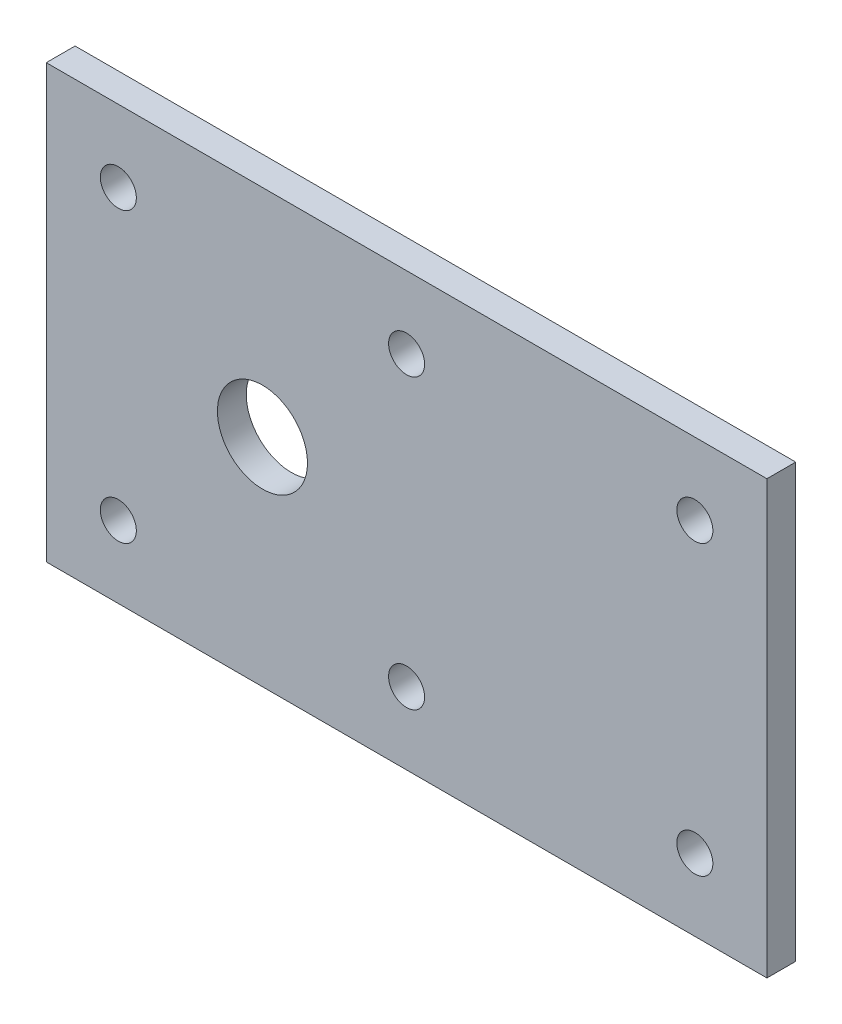
ISO-10303-21;
HEADER;
FILE_DESCRIPTION(('STEP AP214'),'2;1');
FILE_NAME('part.step','',(''),(''),'','','');
FILE_SCHEMA(('AUTOMOTIVE_DESIGN { 1 0 10303 214 1 1 1 1 }'));
ENDSEC;
DATA;
#1=APPLICATION_CONTEXT('core data for automotive mechanical design processes');
#2=APPLICATION_PROTOCOL_DEFINITION('international standard','automotive_design',2000,#1);
#3=PRODUCT_CONTEXT('',#1,'mechanical');
#4=PRODUCT('Part','Part','',(#3));
#5=PRODUCT_RELATED_PRODUCT_CATEGORY('part','',(#4));
#6=PRODUCT_DEFINITION_FORMATION('','',#4);
#7=PRODUCT_DEFINITION_CONTEXT('part definition',#1,'design');
#8=PRODUCT_DEFINITION('design','',#6,#7);
#9=PRODUCT_DEFINITION_SHAPE('','',#8);
#10=(LENGTH_UNIT() NAMED_UNIT(*) SI_UNIT(.MILLI.,.METRE.));
#11=(NAMED_UNIT(*) PLANE_ANGLE_UNIT() SI_UNIT($,.RADIAN.));
#12=(NAMED_UNIT(*) SI_UNIT($,.STERADIAN.) SOLID_ANGLE_UNIT());
#13=UNCERTAINTY_MEASURE_WITH_UNIT(LENGTH_MEASURE(1.E-05),#10,'distance_accuracy_value','');
#14=(GEOMETRIC_REPRESENTATION_CONTEXT(3) GLOBAL_UNCERTAINTY_ASSIGNED_CONTEXT((#13)) GLOBAL_UNIT_ASSIGNED_CONTEXT((#10,
#11,#12)) REPRESENTATION_CONTEXT('',''));
#15=CARTESIAN_POINT('',(0.,0.,0.));
#16=DIRECTION('',(0.,0.,1.));
#17=DIRECTION('',(1.,0.,0.));
#18=AXIS2_PLACEMENT_3D('',#15,#16,#17);
#19=CARTESIAN_POINT('',(-60.,60.,8.));
#20=DIRECTION('',(1.,0.,0.));
#21=DIRECTION('',(0.,1.,0.));
#22=AXIS2_PLACEMENT_3D('',#19,#20,#21);
#23=PLANE('',#22);
#24=DIRECTION('',(0.,-1.,0.));
#25=VECTOR('',#24,1.);
#26=CARTESIAN_POINT('',(-60.,60.,0.));
#27=LINE('',#26,#25);
#28=CARTESIAN_POINT('',(-60.,60.,0.));
#29=VERTEX_POINT('',#28);
#30=CARTESIAN_POINT('',(-60.,-60.,0.));
#31=VERTEX_POINT('',#30);
#32=EDGE_CURVE('E101',#29,#31,#27,.T.);
#33=ORIENTED_EDGE('',*,*,#32,.T.);
#34=DIRECTION('',(0.,0.,-1.));
#35=VECTOR('',#34,1.);
#36=CARTESIAN_POINT('',(-60.,-60.,8.));
#37=LINE('',#36,#35);
#38=CARTESIAN_POINT('',(-60.,-60.,8.));
#39=VERTEX_POINT('',#38);
#40=EDGE_CURVE('E92',#39,#31,#37,.T.);
#41=ORIENTED_EDGE('',*,*,#40,.F.);
#42=DIRECTION('',(0.,-1.,0.));
#43=VECTOR('',#42,1.);
#44=CARTESIAN_POINT('',(-60.,60.,8.));
#45=LINE('',#44,#43);
#46=CARTESIAN_POINT('',(-60.,60.,8.));
#47=VERTEX_POINT('',#46);
#48=EDGE_CURVE('E86',#47,#39,#45,.T.);
#49=ORIENTED_EDGE('',*,*,#48,.F.);
#50=DIRECTION('',(0.,0.,-1.));
#51=VECTOR('',#50,1.);
#52=CARTESIAN_POINT('',(-60.,60.,8.));
#53=LINE('',#52,#51);
#54=EDGE_CURVE('E97',#47,#29,#53,.T.);
#55=ORIENTED_EDGE('',*,*,#54,.T.);
#56=EDGE_LOOP('',(#33,#41,#49,#55));
#57=FACE_BOUND('',#56,.T.);
#58=ADVANCED_FACE('F32',(#57),#23,.F.);
#59=CARTESIAN_POINT('',(140.,-60.,8.));
#60=DIRECTION('',(0.,1.,0.));
#61=DIRECTION('',(0.,0.,1.));
#62=AXIS2_PLACEMENT_3D('',#59,#60,#61);
#63=PLANE('',#62);
#64=DIRECTION('',(1.,0.,0.));
#65=VECTOR('',#64,1.);
#66=CARTESIAN_POINT('',(140.,-60.,0.));
#67=LINE('',#66,#65);
#68=CARTESIAN_POINT('',(140.,-60.,0.));
#69=VERTEX_POINT('',#68);
#70=EDGE_CURVE('E91',#31,#69,#67,.T.);
#71=ORIENTED_EDGE('',*,*,#70,.T.);
#72=DIRECTION('',(0.,0.,-1.));
#73=VECTOR('',#72,1.);
#74=CARTESIAN_POINT('',(140.,-60.,8.));
#75=LINE('',#74,#73);
#76=CARTESIAN_POINT('',(140.,-60.,8.));
#77=VERTEX_POINT('',#76);
#78=EDGE_CURVE('E89',#77,#69,#75,.T.);
#79=ORIENTED_EDGE('',*,*,#78,.F.);
#80=DIRECTION('',(1.,0.,0.));
#81=VECTOR('',#80,1.);
#82=CARTESIAN_POINT('',(140.,-60.,8.));
#83=LINE('',#82,#81);
#84=EDGE_CURVE('E80',#39,#77,#83,.T.);
#85=ORIENTED_EDGE('',*,*,#84,.F.);
#86=ORIENTED_EDGE('',*,*,#40,.T.);
#87=EDGE_LOOP('',(#71,#79,#85,#86));
#88=FACE_BOUND('',#87,.T.);
#89=ADVANCED_FACE('F90',(#88),#63,.F.);
#90=CARTESIAN_POINT('',(140.,60.,8.));
#91=DIRECTION('',(-1.,0.,0.));
#92=DIRECTION('',(0.,-1.,0.));
#93=AXIS2_PLACEMENT_3D('',#90,#91,#92);
#94=PLANE('',#93);
#95=DIRECTION('',(0.,1.,0.));
#96=VECTOR('',#95,1.);
#97=CARTESIAN_POINT('',(140.,60.,0.));
#98=LINE('',#97,#96);
#99=CARTESIAN_POINT('',(140.,60.,0.));
#100=VERTEX_POINT('',#99);
#101=EDGE_CURVE('E66',#69,#100,#98,.T.);
#102=ORIENTED_EDGE('',*,*,#101,.T.);
#103=DIRECTION('',(0.,0.,-1.));
#104=VECTOR('',#103,1.);
#105=CARTESIAN_POINT('',(140.,60.,8.));
#106=LINE('',#105,#104);
#107=CARTESIAN_POINT('',(140.,60.,8.));
#108=VERTEX_POINT('',#107);
#109=EDGE_CURVE('E93',#108,#100,#106,.T.);
#110=ORIENTED_EDGE('',*,*,#109,.F.);
#111=DIRECTION('',(0.,1.,0.));
#112=VECTOR('',#111,1.);
#113=CARTESIAN_POINT('',(140.,60.,8.));
#114=LINE('',#113,#112);
#115=EDGE_CURVE('E84',#77,#108,#114,.T.);
#116=ORIENTED_EDGE('',*,*,#115,.F.);
#117=ORIENTED_EDGE('',*,*,#78,.T.);
#118=EDGE_LOOP('',(#102,#110,#116,#117));
#119=FACE_BOUND('',#118,.T.);
#120=ADVANCED_FACE('F95',(#119),#94,.F.);
#121=CARTESIAN_POINT('',(140.,60.,8.));
#122=DIRECTION('',(0.,-1.,0.));
#123=DIRECTION('',(1.,0.,0.));
#124=AXIS2_PLACEMENT_3D('',#121,#122,#123);
#125=PLANE('',#124);
#126=DIRECTION('',(-1.,0.,0.));
#127=VECTOR('',#126,1.);
#128=CARTESIAN_POINT('',(140.,60.,0.));
#129=LINE('',#128,#127);
#130=EDGE_CURVE('E72',#100,#29,#129,.T.);
#131=ORIENTED_EDGE('',*,*,#130,.T.);
#132=ORIENTED_EDGE('',*,*,#54,.F.);
#133=DIRECTION('',(-1.,0.,0.));
#134=VECTOR('',#133,1.);
#135=CARTESIAN_POINT('',(140.,60.,8.));
#136=LINE('',#135,#134);
#137=EDGE_CURVE('E49',#108,#47,#136,.T.);
#138=ORIENTED_EDGE('',*,*,#137,.F.);
#139=ORIENTED_EDGE('',*,*,#109,.T.);
#140=EDGE_LOOP('',(#131,#132,#138,#139));
#141=FACE_BOUND('',#140,.T.);
#142=ADVANCED_FACE('F140',(#141),#125,.F.);
#143=CARTESIAN_POINT('',(0.,0.,8.));
#144=DIRECTION('',(0.,0.,-1.));
#145=DIRECTION('',(-1.,0.,0.));
#146=AXIS2_PLACEMENT_3D('',#143,#144,#145);
#147=PLANE('',#146);
#148=CARTESIAN_POINT('',(0.,0.,8.));
#149=DIRECTION('',(0.,0.,1.));
#150=DIRECTION('',(1.,0.,0.));
#151=AXIS2_PLACEMENT_3D('',#148,#149,#150);
#152=CIRCLE('',#151,12.5);
#153=CARTESIAN_POINT('',(12.5,0.,8.));
#154=VERTEX_POINT('',#153);
#155=EDGE_CURVE('E293',#154,#154,#152,.T.);
#156=ORIENTED_EDGE('',*,*,#155,.F.);
#157=EDGE_LOOP('',(#156));
#158=FACE_BOUND('',#157,.T.);
#159=CARTESIAN_POINT('',(40.,40.,8.));
#160=DIRECTION('',(0.,0.,1.));
#161=DIRECTION('',(1.,0.,0.));
#162=AXIS2_PLACEMENT_3D('',#159,#160,#161);
#163=CIRCLE('',#162,5.00000000000001);
#164=CARTESIAN_POINT('',(45.,40.,8.));
#165=VERTEX_POINT('',#164);
#166=EDGE_CURVE('E267',#165,#165,#163,.T.);
#167=ORIENTED_EDGE('',*,*,#166,.F.);
#168=EDGE_LOOP('',(#167));
#169=FACE_BOUND('',#168,.T.);
#170=CARTESIAN_POINT('',(-40.,40.,8.));
#171=DIRECTION('',(0.,0.,1.));
#172=DIRECTION('',(1.,0.,0.));
#173=AXIS2_PLACEMENT_3D('',#170,#171,#172);
#174=CIRCLE('',#173,5.00000000000001);
#175=CARTESIAN_POINT('',(-35.,40.,8.));
#176=VERTEX_POINT('',#175);
#177=EDGE_CURVE('E268',#176,#176,#174,.T.);
#178=ORIENTED_EDGE('',*,*,#177,.F.);
#179=EDGE_LOOP('',(#178));
#180=FACE_BOUND('',#179,.T.);
#181=ORIENTED_EDGE('',*,*,#48,.T.);
#182=ORIENTED_EDGE('',*,*,#84,.T.);
#183=ORIENTED_EDGE('',*,*,#115,.T.);
#184=ORIENTED_EDGE('',*,*,#137,.T.);
#185=EDGE_LOOP('',(#181,#182,#183,#184));
#186=FACE_BOUND('',#185,.T.);
#187=CARTESIAN_POINT('',(120.,40.,8.));
#188=DIRECTION('',(0.,0.,1.));
#189=DIRECTION('',(1.,0.,0.));
#190=AXIS2_PLACEMENT_3D('',#187,#188,#189);
#191=CIRCLE('',#190,5.00000000000001);
#192=CARTESIAN_POINT('',(125.,40.,8.));
#193=VERTEX_POINT('',#192);
#194=EDGE_CURVE('E114',#193,#193,#191,.T.);
#195=ORIENTED_EDGE('',*,*,#194,.F.);
#196=EDGE_LOOP('',(#195));
#197=FACE_BOUND('',#196,.T.);
#198=CARTESIAN_POINT('',(-40.,-40.,8.));
#199=DIRECTION('',(0.,0.,1.));
#200=DIRECTION('',(1.,0.,0.));
#201=AXIS2_PLACEMENT_3D('',#198,#199,#200);
#202=CIRCLE('',#201,5.00000000000001);
#203=CARTESIAN_POINT('',(-35.,-40.,8.));
#204=VERTEX_POINT('',#203);
#205=EDGE_CURVE('E120',#204,#204,#202,.T.);
#206=ORIENTED_EDGE('',*,*,#205,.F.);
#207=EDGE_LOOP('',(#206));
#208=FACE_BOUND('',#207,.T.);
#209=CARTESIAN_POINT('',(40.,-40.,8.));
#210=DIRECTION('',(0.,0.,1.));
#211=DIRECTION('',(1.,0.,0.));
#212=AXIS2_PLACEMENT_3D('',#209,#210,#211);
#213=CIRCLE('',#212,5.00000000000001);
#214=CARTESIAN_POINT('',(45.,-40.,8.));
#215=VERTEX_POINT('',#214);
#216=EDGE_CURVE('E126',#215,#215,#213,.T.);
#217=ORIENTED_EDGE('',*,*,#216,.F.);
#218=EDGE_LOOP('',(#217));
#219=FACE_BOUND('',#218,.T.);
#220=CARTESIAN_POINT('',(120.,-40.,8.));
#221=DIRECTION('',(0.,0.,1.));
#222=DIRECTION('',(1.,0.,0.));
#223=AXIS2_PLACEMENT_3D('',#220,#221,#222);
#224=CIRCLE('',#223,5.00000000000001);
#225=CARTESIAN_POINT('',(125.,-40.,8.));
#226=VERTEX_POINT('',#225);
#227=EDGE_CURVE('E11',#226,#226,#224,.T.);
#228=ORIENTED_EDGE('',*,*,#227,.F.);
#229=EDGE_LOOP('',(#228));
#230=FACE_BOUND('',#229,.T.);
#231=ADVANCED_FACE('F81',(#158,#169,#180,#186,#197,#208,#219,#230),#147,.F.);
#232=CARTESIAN_POINT('',(0.,0.,0.));
#233=DIRECTION('',(0.,0.,-1.));
#234=DIRECTION('',(-1.,0.,0.));
#235=AXIS2_PLACEMENT_3D('',#232,#233,#234);
#236=PLANE('',#235);
#237=CARTESIAN_POINT('',(0.,0.,0.));
#238=DIRECTION('',(0.,0.,1.));
#239=DIRECTION('',(1.,0.,0.));
#240=AXIS2_PLACEMENT_3D('',#237,#238,#239);
#241=CIRCLE('',#240,12.5);
#242=CARTESIAN_POINT('',(12.5,0.,0.));
#243=VERTEX_POINT('',#242);
#244=EDGE_CURVE('E272',#243,#243,#241,.T.);
#245=ORIENTED_EDGE('',*,*,#244,.T.);
#246=EDGE_LOOP('',(#245));
#247=FACE_BOUND('',#246,.T.);
#248=CARTESIAN_POINT('',(40.,40.,0.));
#249=DIRECTION('',(0.,0.,1.));
#250=DIRECTION('',(1.,0.,0.));
#251=AXIS2_PLACEMENT_3D('',#248,#249,#250);
#252=CIRCLE('',#251,5.00000000000001);
#253=CARTESIAN_POINT('',(45.,40.,0.));
#254=VERTEX_POINT('',#253);
#255=EDGE_CURVE('E264',#254,#254,#252,.T.);
#256=ORIENTED_EDGE('',*,*,#255,.T.);
#257=EDGE_LOOP('',(#256));
#258=FACE_BOUND('',#257,.T.);
#259=CARTESIAN_POINT('',(-40.,40.,0.));
#260=DIRECTION('',(0.,0.,1.));
#261=DIRECTION('',(1.,0.,0.));
#262=AXIS2_PLACEMENT_3D('',#259,#260,#261);
#263=CIRCLE('',#262,5.00000000000001);
#264=CARTESIAN_POINT('',(-35.,40.,0.));
#265=VERTEX_POINT('',#264);
#266=EDGE_CURVE('E104',#265,#265,#263,.T.);
#267=ORIENTED_EDGE('',*,*,#266,.T.);
#268=EDGE_LOOP('',(#267));
#269=FACE_BOUND('',#268,.T.);
#270=ORIENTED_EDGE('',*,*,#32,.F.);
#271=ORIENTED_EDGE('',*,*,#130,.F.);
#272=ORIENTED_EDGE('',*,*,#101,.F.);
#273=ORIENTED_EDGE('',*,*,#70,.F.);
#274=EDGE_LOOP('',(#270,#271,#272,#273));
#275=FACE_BOUND('',#274,.T.);
#276=CARTESIAN_POINT('',(120.,40.,0.));
#277=DIRECTION('',(0.,0.,1.));
#278=DIRECTION('',(1.,0.,0.));
#279=AXIS2_PLACEMENT_3D('',#276,#277,#278);
#280=CIRCLE('',#279,5.00000000000001);
#281=CARTESIAN_POINT('',(125.,40.,0.));
#282=VERTEX_POINT('',#281);
#283=EDGE_CURVE('E111',#282,#282,#280,.T.);
#284=ORIENTED_EDGE('',*,*,#283,.T.);
#285=EDGE_LOOP('',(#284));
#286=FACE_BOUND('',#285,.T.);
#287=CARTESIAN_POINT('',(-40.,-40.,0.));
#288=DIRECTION('',(0.,0.,1.));
#289=DIRECTION('',(1.,0.,0.));
#290=AXIS2_PLACEMENT_3D('',#287,#288,#289);
#291=CIRCLE('',#290,5.00000000000001);
#292=CARTESIAN_POINT('',(-35.,-40.,0.));
#293=VERTEX_POINT('',#292);
#294=EDGE_CURVE('E117',#293,#293,#291,.T.);
#295=ORIENTED_EDGE('',*,*,#294,.T.);
#296=EDGE_LOOP('',(#295));
#297=FACE_BOUND('',#296,.T.);
#298=CARTESIAN_POINT('',(40.,-40.,0.));
#299=DIRECTION('',(0.,0.,1.));
#300=DIRECTION('',(1.,0.,0.));
#301=AXIS2_PLACEMENT_3D('',#298,#299,#300);
#302=CIRCLE('',#301,5.00000000000001);
#303=CARTESIAN_POINT('',(45.,-40.,0.));
#304=VERTEX_POINT('',#303);
#305=EDGE_CURVE('E123',#304,#304,#302,.T.);
#306=ORIENTED_EDGE('',*,*,#305,.T.);
#307=EDGE_LOOP('',(#306));
#308=FACE_BOUND('',#307,.T.);
#309=CARTESIAN_POINT('',(120.,-40.,0.));
#310=DIRECTION('',(0.,0.,1.));
#311=DIRECTION('',(1.,0.,0.));
#312=AXIS2_PLACEMENT_3D('',#309,#310,#311);
#313=CIRCLE('',#312,5.00000000000001);
#314=CARTESIAN_POINT('',(125.,-40.,0.));
#315=VERTEX_POINT('',#314);
#316=EDGE_CURVE('E41',#315,#315,#313,.T.);
#317=ORIENTED_EDGE('',*,*,#316,.T.);
#318=EDGE_LOOP('',(#317));
#319=FACE_BOUND('',#318,.T.);
#320=ADVANCED_FACE('F131',(#247,#258,#269,#275,#286,#297,#308,#319),#236,.T.);
#321=CARTESIAN_POINT('',(-40.,40.,0.));
#322=DIRECTION('',(0.,0.,1.));
#323=DIRECTION('',(1.,0.,0.));
#324=AXIS2_PLACEMENT_3D('',#321,#322,#323);
#325=CYLINDRICAL_SURFACE('',#324,5.00000000000001);
#326=ORIENTED_EDGE('',*,*,#266,.F.);
#327=EDGE_LOOP('',(#326));
#328=FACE_BOUND('',#327,.T.);
#329=ORIENTED_EDGE('',*,*,#177,.T.);
#330=EDGE_LOOP('',(#329));
#331=FACE_BOUND('',#330,.T.);
#332=ADVANCED_FACE('F147',(#328,#331),#325,.F.);
#333=CARTESIAN_POINT('',(40.,40.,0.));
#334=DIRECTION('',(0.,0.,1.));
#335=DIRECTION('',(1.,0.,0.));
#336=AXIS2_PLACEMENT_3D('',#333,#334,#335);
#337=CYLINDRICAL_SURFACE('',#336,5.00000000000001);
#338=ORIENTED_EDGE('',*,*,#255,.F.);
#339=EDGE_LOOP('',(#338));
#340=FACE_BOUND('',#339,.T.);
#341=ORIENTED_EDGE('',*,*,#166,.T.);
#342=EDGE_LOOP('',(#341));
#343=FACE_BOUND('',#342,.T.);
#344=ADVANCED_FACE('F167',(#340,#343),#337,.F.);
#345=CARTESIAN_POINT('',(120.,40.,0.));
#346=DIRECTION('',(0.,0.,1.));
#347=DIRECTION('',(1.,0.,0.));
#348=AXIS2_PLACEMENT_3D('',#345,#346,#347);
#349=CYLINDRICAL_SURFACE('',#348,5.00000000000001);
#350=ORIENTED_EDGE('',*,*,#283,.F.);
#351=EDGE_LOOP('',(#350));
#352=FACE_BOUND('',#351,.T.);
#353=ORIENTED_EDGE('',*,*,#194,.T.);
#354=EDGE_LOOP('',(#353));
#355=FACE_BOUND('',#354,.T.);
#356=ADVANCED_FACE('F163',(#352,#355),#349,.F.);
#357=CARTESIAN_POINT('',(-40.,-40.,0.));
#358=DIRECTION('',(0.,0.,1.));
#359=DIRECTION('',(1.,0.,0.));
#360=AXIS2_PLACEMENT_3D('',#357,#358,#359);
#361=CYLINDRICAL_SURFACE('',#360,5.00000000000001);
#362=ORIENTED_EDGE('',*,*,#294,.F.);
#363=EDGE_LOOP('',(#362));
#364=FACE_BOUND('',#363,.T.);
#365=ORIENTED_EDGE('',*,*,#205,.T.);
#366=EDGE_LOOP('',(#365));
#367=FACE_BOUND('',#366,.T.);
#368=ADVANCED_FACE('F166',(#364,#367),#361,.F.);
#369=CARTESIAN_POINT('',(40.,-40.,0.));
#370=DIRECTION('',(0.,0.,1.));
#371=DIRECTION('',(1.,0.,0.));
#372=AXIS2_PLACEMENT_3D('',#369,#370,#371);
#373=CYLINDRICAL_SURFACE('',#372,5.00000000000001);
#374=ORIENTED_EDGE('',*,*,#305,.F.);
#375=EDGE_LOOP('',(#374));
#376=FACE_BOUND('',#375,.T.);
#377=ORIENTED_EDGE('',*,*,#216,.T.);
#378=EDGE_LOOP('',(#377));
#379=FACE_BOUND('',#378,.T.);
#380=ADVANCED_FACE('F136',(#376,#379),#373,.F.);
#381=CARTESIAN_POINT('',(120.,-40.,0.));
#382=DIRECTION('',(0.,0.,1.));
#383=DIRECTION('',(1.,0.,0.));
#384=AXIS2_PLACEMENT_3D('',#381,#382,#383);
#385=CYLINDRICAL_SURFACE('',#384,5.00000000000001);
#386=ORIENTED_EDGE('',*,*,#316,.F.);
#387=EDGE_LOOP('',(#386));
#388=FACE_BOUND('',#387,.T.);
#389=ORIENTED_EDGE('',*,*,#227,.T.);
#390=EDGE_LOOP('',(#389));
#391=FACE_BOUND('',#390,.T.);
#392=ADVANCED_FACE('F34',(#388,#391),#385,.F.);
#393=CARTESIAN_POINT('',(0.,0.,0.));
#394=DIRECTION('',(0.,0.,1.));
#395=DIRECTION('',(1.,0.,0.));
#396=AXIS2_PLACEMENT_3D('',#393,#394,#395);
#397=CYLINDRICAL_SURFACE('',#396,12.5);
#398=ORIENTED_EDGE('',*,*,#244,.F.);
#399=EDGE_LOOP('',(#398));
#400=FACE_BOUND('',#399,.T.);
#401=ORIENTED_EDGE('',*,*,#155,.T.);
#402=EDGE_LOOP('',(#401));
#403=FACE_BOUND('',#402,.T.);
#404=ADVANCED_FACE('F135',(#400,#403),#397,.F.);
#405=CLOSED_SHELL('',(#58,#89,#120,#142,#231,#320,#332,#344,#356,#368,#380,#392,#404));
#406=MANIFOLD_SOLID_BREP('B2',#405);
#407=ADVANCED_BREP_SHAPE_REPRESENTATION('',(#18,#406),#14);
#408=SHAPE_DEFINITION_REPRESENTATION(#9,#407);
ENDSEC;
END-ISO-10303-21;
